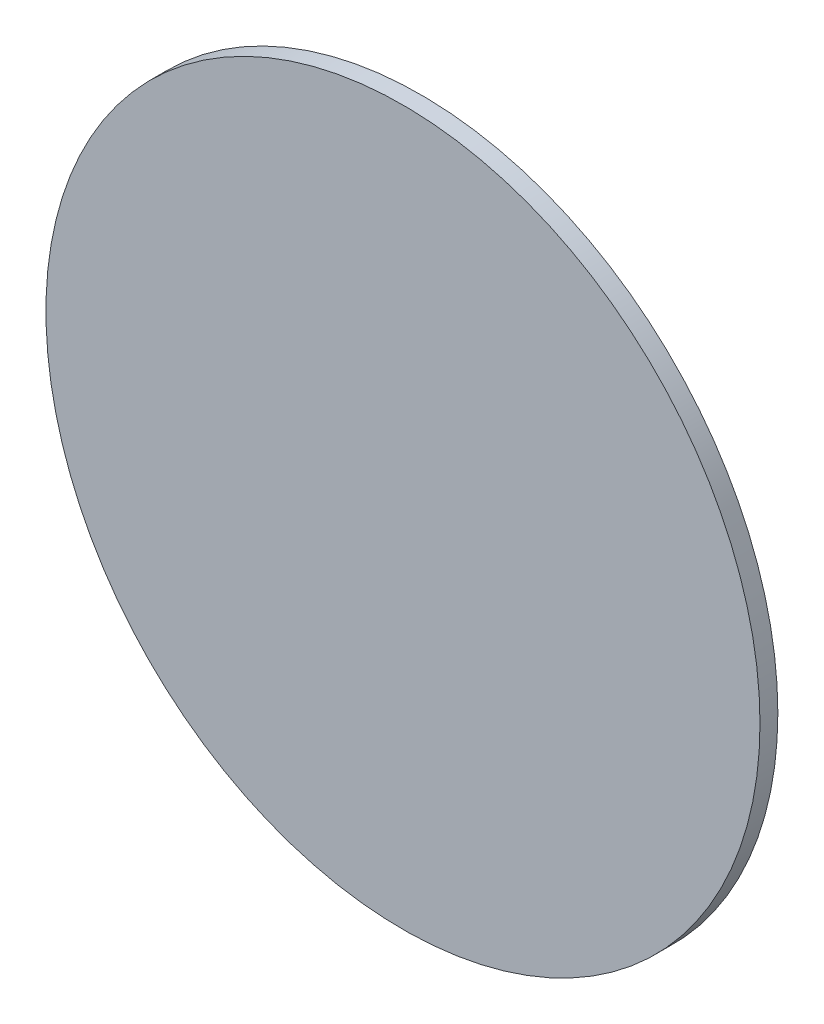
ISO-10303-21;
HEADER;
FILE_DESCRIPTION(('STEP AP214'),'2;1');
FILE_NAME('part.step','',(''),(''),'','','');
FILE_SCHEMA(('AUTOMOTIVE_DESIGN { 1 0 10303 214 1 1 1 1 }'));
ENDSEC;
DATA;
#1=APPLICATION_CONTEXT('core data for automotive mechanical design processes');
#2=APPLICATION_PROTOCOL_DEFINITION('international standard','automotive_design',2000,#1);
#3=PRODUCT_CONTEXT('',#1,'mechanical');
#4=PRODUCT('Part','Part','',(#3));
#5=PRODUCT_RELATED_PRODUCT_CATEGORY('part','',(#4));
#6=PRODUCT_DEFINITION_FORMATION('','',#4);
#7=PRODUCT_DEFINITION_CONTEXT('part definition',#1,'design');
#8=PRODUCT_DEFINITION('design','',#6,#7);
#9=PRODUCT_DEFINITION_SHAPE('','',#8);
#10=(LENGTH_UNIT() NAMED_UNIT(*) SI_UNIT(.MILLI.,.METRE.));
#11=(NAMED_UNIT(*) PLANE_ANGLE_UNIT() SI_UNIT($,.RADIAN.));
#12=(NAMED_UNIT(*) SI_UNIT($,.STERADIAN.) SOLID_ANGLE_UNIT());
#13=UNCERTAINTY_MEASURE_WITH_UNIT(LENGTH_MEASURE(1.E-05),#10,'distance_accuracy_value','');
#14=(GEOMETRIC_REPRESENTATION_CONTEXT(3) GLOBAL_UNCERTAINTY_ASSIGNED_CONTEXT((#13)) GLOBAL_UNIT_ASSIGNED_CONTEXT((#10,
#11,#12)) REPRESENTATION_CONTEXT('',''));
#15=CARTESIAN_POINT('',(0.,0.,0.));
#16=DIRECTION('',(0.,0.,1.));
#17=DIRECTION('',(1.,0.,0.));
#18=AXIS2_PLACEMENT_3D('',#15,#16,#17);
#19=CARTESIAN_POINT('',(60.,0.,-3.00000000000042));
#20=DIRECTION('',(0.,0.,-1.));
#21=DIRECTION('',(-1.,0.,0.));
#22=AXIS2_PLACEMENT_3D('',#19,#20,#21);
#23=PLANE('',#22);
#24=CARTESIAN_POINT('',(0.,0.,-3.));
#25=DIRECTION('',(0.,0.,1.));
#26=DIRECTION('',(1.,0.,0.));
#27=AXIS2_PLACEMENT_3D('',#24,#25,#26);
#28=CIRCLE('',#27,30.);
#29=CARTESIAN_POINT('',(30.,0.,-3.00000000000021));
#30=VERTEX_POINT('',#29);
#31=EDGE_CURVE('E10',#30,#30,#28,.T.);
#32=ORIENTED_EDGE('',*,*,#31,.T.);
#33=EDGE_LOOP('',(#32));
#34=FACE_BOUND('',#33,.T.);
#35=CARTESIAN_POINT('',(0.,0.,-3.));
#36=DIRECTION('',(0.,0.,1.));
#37=DIRECTION('',(1.,0.,0.));
#38=AXIS2_PLACEMENT_3D('',#35,#36,#37);
#39=CIRCLE('',#38,60.);
#40=CARTESIAN_POINT('',(60.,0.,-3.00000000000042));
#41=VERTEX_POINT('',#40);
#42=EDGE_CURVE('E51',#41,#41,#39,.T.);
#43=ORIENTED_EDGE('',*,*,#42,.F.);
#44=EDGE_LOOP('',(#43));
#45=FACE_BOUND('',#44,.T.);
#46=ADVANCED_FACE('F39',(#34,#45),#23,.T.);
#47=CARTESIAN_POINT('',(0.,0.,-3.00000000000001));
#48=DIRECTION('',(0.,0.,1.));
#49=DIRECTION('',(1.,0.,0.));
#50=AXIS2_PLACEMENT_3D('',#47,#48,#49);
#51=SPHERICAL_SURFACE('',#50,30.);
#52=ORIENTED_EDGE('',*,*,#31,.F.);
#53=EDGE_LOOP('',(#52));
#54=FACE_BOUND('',#53,.T.);
#55=ADVANCED_FACE('F63',(#54),#51,.T.);
#56=CARTESIAN_POINT('',(0.,0.,0.));
#57=DIRECTION('',(0.,0.,1.));
#58=DIRECTION('',(1.,0.,0.));
#59=AXIS2_PLACEMENT_3D('',#56,#57,#58);
#60=PLANE('',#59);
#61=CARTESIAN_POINT('',(0.,0.,0.));
#62=DIRECTION('',(0.,0.,1.));
#63=DIRECTION('',(1.,0.,0.));
#64=AXIS2_PLACEMENT_3D('',#61,#62,#63);
#65=CIRCLE('',#64,60.);
#66=CARTESIAN_POINT('',(60.,0.,-4.18977760661176E-13));
#67=VERTEX_POINT('',#66);
#68=EDGE_CURVE('E46',#67,#67,#65,.T.);
#69=ORIENTED_EDGE('',*,*,#68,.T.);
#70=EDGE_LOOP('',(#69));
#71=FACE_BOUND('',#70,.T.);
#72=ADVANCED_FACE('F67',(#71),#60,.T.);
#73=CARTESIAN_POINT('',(0.,0.,0.));
#74=DIRECTION('',(0.,0.,1.));
#75=DIRECTION('',(1.,0.,0.));
#76=AXIS2_PLACEMENT_3D('',#73,#74,#75);
#77=CYLINDRICAL_SURFACE('',#76,60.);
#78=ORIENTED_EDGE('',*,*,#42,.T.);
#79=EDGE_LOOP('',(#78));
#80=FACE_BOUND('',#79,.T.);
#81=ORIENTED_EDGE('',*,*,#68,.F.);
#82=EDGE_LOOP('',(#81));
#83=FACE_BOUND('',#82,.T.);
#84=ADVANCED_FACE('F59',(#80,#83),#77,.T.);
#85=CLOSED_SHELL('',(#46,#55,#72,#84));
#86=MANIFOLD_SOLID_BREP('B2',#85);
#87=ADVANCED_BREP_SHAPE_REPRESENTATION('',(#18,#86),#14);
#88=SHAPE_DEFINITION_REPRESENTATION(#9,#87);
ENDSEC;
END-ISO-10303-21;
